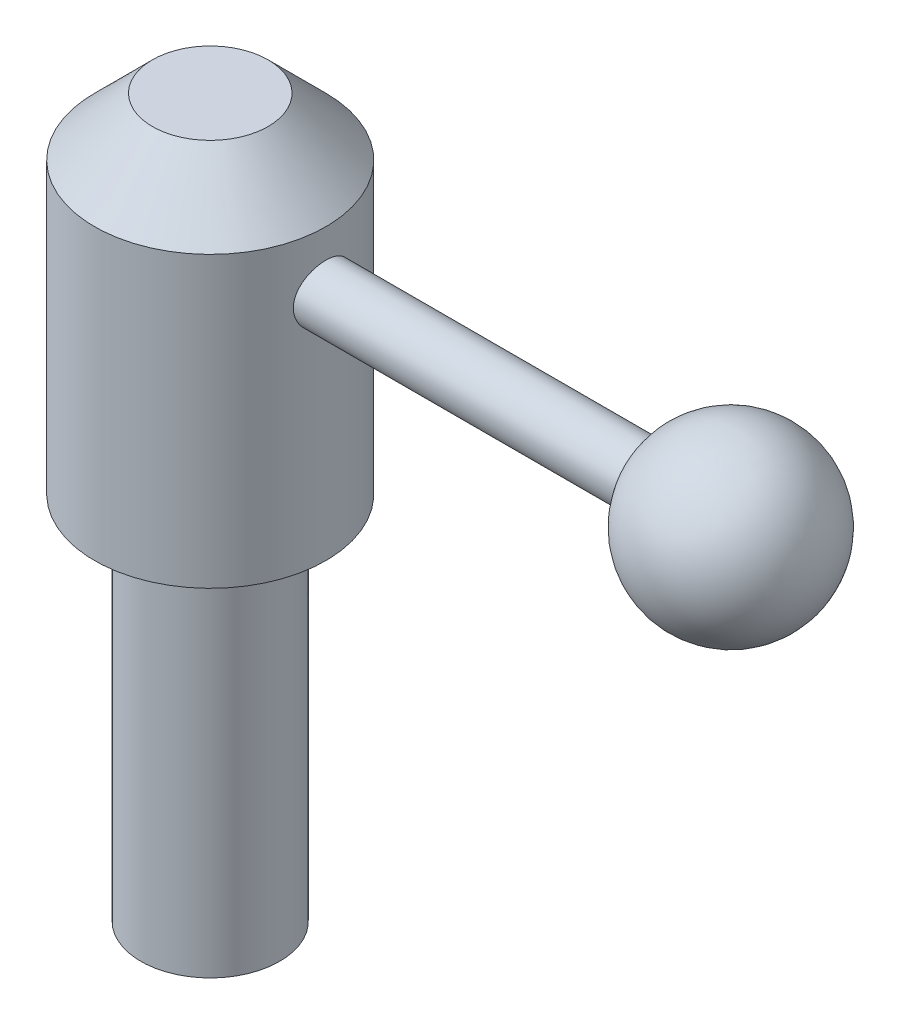
ISO-10303-21;
HEADER;
FILE_DESCRIPTION(('STEP AP214'),'2;1');
FILE_NAME('part.step','',(''),(''),'','','');
FILE_SCHEMA(('AUTOMOTIVE_DESIGN { 1 0 10303 214 1 1 1 1 }'));
ENDSEC;
DATA;
#1=APPLICATION_CONTEXT('core data for automotive mechanical design processes');
#2=APPLICATION_PROTOCOL_DEFINITION('international standard','automotive_design',2000,#1);
#3=PRODUCT_CONTEXT('',#1,'mechanical');
#4=PRODUCT('Part','Part','',(#3));
#5=PRODUCT_RELATED_PRODUCT_CATEGORY('part','',(#4));
#6=PRODUCT_DEFINITION_FORMATION('','',#4);
#7=PRODUCT_DEFINITION_CONTEXT('part definition',#1,'design');
#8=PRODUCT_DEFINITION('design','',#6,#7);
#9=PRODUCT_DEFINITION_SHAPE('','',#8);
#10=(LENGTH_UNIT() NAMED_UNIT(*) SI_UNIT(.MILLI.,.METRE.));
#11=(NAMED_UNIT(*) PLANE_ANGLE_UNIT() SI_UNIT($,.RADIAN.));
#12=(NAMED_UNIT(*) SI_UNIT($,.STERADIAN.) SOLID_ANGLE_UNIT());
#13=UNCERTAINTY_MEASURE_WITH_UNIT(LENGTH_MEASURE(1.E-05),#10,'distance_accuracy_value','');
#14=(GEOMETRIC_REPRESENTATION_CONTEXT(3) GLOBAL_UNCERTAINTY_ASSIGNED_CONTEXT((#13)) GLOBAL_UNIT_ASSIGNED_CONTEXT((#10,
#11,#12)) REPRESENTATION_CONTEXT('',''));
#15=CARTESIAN_POINT('',(0.,0.,0.));
#16=DIRECTION('',(0.,0.,1.));
#17=DIRECTION('',(1.,0.,0.));
#18=AXIS2_PLACEMENT_3D('',#15,#16,#17);
#19=CARTESIAN_POINT('',(0.,0.,0.));
#20=DIRECTION('',(0.,-1.,0.));
#21=DIRECTION('',(0.,0.,-1.));
#22=AXIS2_PLACEMENT_3D('',#19,#20,#21);
#23=CYLINDRICAL_SURFACE('',#22,10.);
#24=CARTESIAN_POINT('',(0.,57.,0.));
#25=DIRECTION('',(0.,-1.,0.));
#26=DIRECTION('',(0.,0.,-1.));
#27=AXIS2_PLACEMENT_3D('',#24,#25,#26);
#28=CIRCLE('',#27,10.);
#29=CARTESIAN_POINT('',(0.,57.,-10.));
#30=VERTEX_POINT('',#29);
#31=EDGE_CURVE('E57',#30,#30,#28,.T.);
#32=ORIENTED_EDGE('',*,*,#31,.T.);
#33=EDGE_LOOP('',(#32));
#34=FACE_BOUND('',#33,.T.);
#35=CARTESIAN_POINT('',(0.,32.,0.));
#36=DIRECTION('',(0.,-1.,0.));
#37=DIRECTION('',(0.,0.,-1.));
#38=AXIS2_PLACEMENT_3D('',#35,#36,#37);
#39=CIRCLE('',#38,10.);
#40=CARTESIAN_POINT('',(0.,32.,-10.));
#41=VERTEX_POINT('',#40);
#42=EDGE_CURVE('E66',#41,#41,#39,.T.);
#43=ORIENTED_EDGE('',*,*,#42,.F.);
#44=EDGE_LOOP('',(#43));
#45=FACE_BOUND('',#44,.T.);
#46=CARTESIAN_POINT('',(9.68245836551854,52.,2.5));
#47=CARTESIAN_POINT('',(9.68246100087859,51.8619492490734,2.49999607859307));
#48=CARTESIAN_POINT('',(9.68544306014597,51.7238551013215,2.48852624549765));
#49=CARTESIAN_POINT('',(9.69701861992564,51.4516324218265,2.44302312546379));
#50=CARTESIAN_POINT('',(9.7056153862163,51.3175062455318,2.40897670674211));
#51=CARTESIAN_POINT('',(9.7273872459615,51.0571964618128,2.31949119963204));
#52=CARTESIAN_POINT('',(9.74055642690458,50.9310028446143,2.26407972785449));
#53=CARTESIAN_POINT('',(9.76998192028759,50.6896891474601,2.13352114126139));
#54=CARTESIAN_POINT('',(9.78623836378489,50.5745695379198,2.05837318856069));
#55=CARTESIAN_POINT('',(9.82040716355625,50.3561383547378,1.88870842731188));
#56=CARTESIAN_POINT('',(9.83834597623034,50.25310639965,1.79383688770405));
#57=CARTESIAN_POINT('',(9.87362875515294,50.0642386056397,1.58818206410066));
#58=CARTESIAN_POINT('',(9.89097266566388,49.9784043743783,1.4773972941803));
#59=CARTESIAN_POINT('',(9.92340415520582,49.8252245323687,1.24114520107895));
#60=CARTESIAN_POINT('',(9.93845687400592,49.7581536118385,1.11549457619512));
#61=CARTESIAN_POINT('',(9.96430811925984,49.6461903558469,0.854263184292759));
#62=CARTESIAN_POINT('',(9.97510727334344,49.6012947480845,0.718683885791938));
#63=CARTESIAN_POINT('',(9.9910475884818,49.5358521654214,0.44435875875416));
#64=CARTESIAN_POINT('',(9.99629893844314,49.5148303556734,0.305732719548973));
#65=CARTESIAN_POINT('',(10.000935941073,49.4962416207244,0.0268288192627658));
#66=CARTESIAN_POINT('',(10.000322460967,49.4986712277904,-0.113448794538073));
#67=CARTESIAN_POINT('',(9.99338094953533,49.5265748502501,-0.388380617930973));
#68=CARTESIAN_POINT('',(9.9871800234087,49.5515363250539,-0.523090539002673));
#69=CARTESIAN_POINT('',(9.96990836524857,49.6229712700485,-0.786345618534221));
#70=CARTESIAN_POINT('',(9.95883737398452,49.6694458853774,-0.9148904484261));
#71=CARTESIAN_POINT('',(9.93287509700884,49.7830025706871,-1.16351675875452));
#72=CARTESIAN_POINT('',(9.9179501969501,49.8502670446617,-1.28351127441626));
#73=CARTESIAN_POINT('',(9.88589903809692,50.0033556791163,-1.51068905585123));
#74=CARTESIAN_POINT('',(9.8687723965265,50.0891830685606,-1.61787008771377));
#75=CARTESIAN_POINT('',(9.83363713769356,50.2797087419824,-1.81943508771239));
#76=CARTESIAN_POINT('',(9.81561719525297,50.3848548923478,-1.91339419768799));
#77=CARTESIAN_POINT('',(9.78115043517327,50.6095999735403,-2.08244093990756));
#78=CARTESIAN_POINT('',(9.76470369108288,50.7291995794911,-2.15752769011507));
#79=CARTESIAN_POINT('',(9.73520496829319,50.9802900341489,-2.28697032255647));
#80=CARTESIAN_POINT('',(9.72216983717007,51.1118357303128,-2.34122391742613));
#81=CARTESIAN_POINT('',(9.70118640148668,51.3825854680769,-2.42671405159096));
#82=CARTESIAN_POINT('',(9.69323700842732,51.5217878639846,-2.45795551638266));
#83=CARTESIAN_POINT('',(9.68355356007456,51.7999595015299,-2.49582963866592));
#84=CARTESIAN_POINT('',(9.68166088976933,51.938837793341,-2.50309047391912));
#85=CARTESIAN_POINT('',(9.68387343364692,52.2158219365853,-2.49451699051516));
#86=CARTESIAN_POINT('',(9.687978095703,52.3539278579494,-2.47868479784981));
#87=CARTESIAN_POINT('',(9.70157081984979,52.6231142649486,-2.42492546393825));
#88=CARTESIAN_POINT('',(9.71096970242531,52.7542727265692,-2.38736406828191));
#89=CARTESIAN_POINT('',(9.73400718262805,53.0084314578533,-2.29161808167046));
#90=CARTESIAN_POINT('',(9.74764628246407,53.1314307590558,-2.2334310477125));
#91=CARTESIAN_POINT('',(9.77796137095511,53.3684412778669,-2.0967706679366));
#92=CARTESIAN_POINT('',(9.79469168607245,53.482228840043,-2.01792175383564));
#93=CARTESIAN_POINT('',(9.82917083071113,53.6951883628015,-1.84265073233612));
#94=CARTESIAN_POINT('',(9.84691982728307,53.7943579166501,-1.74622573701359));
#95=CARTESIAN_POINT('',(9.88197403031773,53.9778110425709,-1.53565680246181));
#96=CARTESIAN_POINT('',(9.8992570206188,54.0616600625488,-1.42112988132898));
#97=CARTESIAN_POINT('',(9.93097216613689,54.2089358669513,-1.17925670673668));
#98=CARTESIAN_POINT('',(9.94540447003949,54.2723637166082,-1.05191112239397));
#99=CARTESIAN_POINT('',(9.96970115738325,54.3764460345279,-0.788895504327726));
#100=CARTESIAN_POINT('',(9.97959830022409,54.4172642843791,-0.653293452569705));
#101=CARTESIAN_POINT('',(9.99385293395789,54.4754603346084,-0.376874400797017));
#102=CARTESIAN_POINT('',(9.99821149393421,54.492842658739,-0.236058412603101));
#103=CARTESIAN_POINT('',(10.0008542352202,54.5034189739388,0.0427088161083089));
#104=CARTESIAN_POINT('',(9.99929947199971,54.4972542727385,0.180634567415056));
#105=CARTESIAN_POINT('',(9.99064741143608,54.4623804317641,0.453418741036879));
#106=CARTESIAN_POINT('',(9.98355027892922,54.4336719624671,0.588277254452324));
#107=CARTESIAN_POINT('',(9.96463582134723,54.3548694505729,0.850427589111937));
#108=CARTESIAN_POINT('',(9.95284411255981,54.3048913667141,0.977756236452158));
#109=CARTESIAN_POINT('',(9.92578222284145,54.1850735524511,1.22229263260406));
#110=CARTESIAN_POINT('',(9.91051160346894,54.1152313183238,1.33949910316409));
#111=CARTESIAN_POINT('',(9.87768124200717,53.9557119150097,1.56350482105826));
#112=CARTESIAN_POINT('',(9.86007542354161,53.8655996427404,1.66998747074584));
#113=CARTESIAN_POINT('',(9.82476622642974,53.6689428700566,1.86653755068376));
#114=CARTESIAN_POINT('',(9.80706282418255,53.5623942097221,1.95660081269148));
#115=CARTESIAN_POINT('',(9.77318689613756,53.3334964645263,2.11940506617958));
#116=CARTESIAN_POINT('',(9.75704909183222,53.2108896915869,2.19179154854095));
#117=CARTESIAN_POINT('',(9.7285988873707,52.954861275313,2.31481724146368));
#118=CARTESIAN_POINT('',(9.71628370583034,52.8214475847654,2.36547227438038));
#119=CARTESIAN_POINT('',(9.69879771876843,52.5735574704121,2.43605632142751));
#120=CARTESIAN_POINT('',(9.69271657508747,52.4602670890347,2.4599829264922));
#121=CARTESIAN_POINT('',(9.6845459645655,52.2313278275058,2.49195573142943));
#122=CARTESIAN_POINT('',(9.68245615722769,52.115679149389,2.50000328592938));
#123=CARTESIAN_POINT('',(9.68245836551854,52.,2.5));
#124=B_SPLINE_CURVE_WITH_KNOTS('',3,(#46,#47,#48,#49,#50,#51,#52,#53,#54,#55,#56,#57,#58,#59,
#60,#61,#62,#63,#64,#65,#66,#67,#68,#69,#70,#71,#72,#73,#74,#75,#76,#77,#78,#79,#80,#81,#82,#83,
#84,#85,#86,#87,#88,#89,#90,#91,#92,#93,#94,#95,#96,#97,#98,#99,#100,#101,#102,#103,#104,#105,
#106,#107,#108,#109,#110,#111,#112,#113,#114,#115,#116,#117,#118,#119,#120,#121,#122,#123),
.UNSPECIFIED.,.T.,.F.,(4,2,2,2,2,2,2,2,2,2,2,2,2,2,2,2,2,2,2,2,2,2,2,2,2,2,2,2,2,2,2,2,2,2,2,2,
2,2,4),(0.,0.413727441736142,0.82769574142867,1.24113072716601,1.65458326755479,
2.07623954192977,2.49793521479867,2.92551496397921,3.35303159847093,3.77188750995347,
4.19068148666021,4.60018262688948,5.00970556724787,5.42292874254445,5.83622385468915,
6.26070466571912,6.68520531199803,7.11176432008404,7.53823200129548,7.95343574764204,
8.36860127188748,8.77697405014152,9.18539521426364,9.60182845864104,10.0183301888999,
10.4452533097027,10.872154157245,11.2959207281187,11.7196054891398,12.131834461324,
12.5440511738193,12.9540487656466,13.3640980574302,13.7839709658702,14.2039503157046,
14.6317647729113,15.0592672137502,15.4059782718573,15.7526597510792),.UNSPECIFIED.);
#125=CARTESIAN_POINT('',(9.68245836551854,52.,2.5));
#126=VERTEX_POINT('',#125);
#127=EDGE_CURVE('E10',#126,#126,#124,.T.);
#128=ORIENTED_EDGE('',*,*,#127,.F.);
#129=EDGE_LOOP('',(#128));
#130=FACE_BOUND('',#129,.T.);
#131=ADVANCED_FACE('F39',(#34,#45,#130),#23,.T.);
#132=CARTESIAN_POINT('',(0.,0.,0.));
#133=DIRECTION('',(0.,1.,0.));
#134=DIRECTION('',(0.,0.,1.));
#135=AXIS2_PLACEMENT_3D('',#132,#133,#134);
#136=PLANE('',#135);
#137=CARTESIAN_POINT('',(0.,0.,0.));
#138=DIRECTION('',(0.,-1.,0.));
#139=DIRECTION('',(0.,0.,-1.));
#140=AXIS2_PLACEMENT_3D('',#137,#138,#139);
#141=CIRCLE('',#140,6.);
#142=CARTESIAN_POINT('',(0.,0.,-6.));
#143=VERTEX_POINT('',#142);
#144=EDGE_CURVE('E58',#143,#143,#141,.T.);
#145=ORIENTED_EDGE('',*,*,#144,.T.);
#146=EDGE_LOOP('',(#145));
#147=FACE_BOUND('',#146,.T.);
#148=ADVANCED_FACE('F82',(#147),#136,.F.);
#149=CARTESIAN_POINT('',(0.,0.,0.));
#150=DIRECTION('',(0.,-1.,0.));
#151=DIRECTION('',(0.,0.,-1.));
#152=AXIS2_PLACEMENT_3D('',#149,#150,#151);
#153=CYLINDRICAL_SURFACE('',#152,6.);
#154=ORIENTED_EDGE('',*,*,#144,.F.);
#155=EDGE_LOOP('',(#154));
#156=FACE_BOUND('',#155,.T.);
#157=CARTESIAN_POINT('',(0.,32.,0.));
#158=DIRECTION('',(0.,-1.,0.));
#159=DIRECTION('',(0.,0.,-1.));
#160=AXIS2_PLACEMENT_3D('',#157,#158,#159);
#161=CIRCLE('',#160,6.);
#162=CARTESIAN_POINT('',(0.,32.,-6.));
#163=VERTEX_POINT('',#162);
#164=EDGE_CURVE('E63',#163,#163,#161,.T.);
#165=ORIENTED_EDGE('',*,*,#164,.T.);
#166=EDGE_LOOP('',(#165));
#167=FACE_BOUND('',#166,.T.);
#168=ADVANCED_FACE('F93',(#156,#167),#153,.T.);
#169=CARTESIAN_POINT('',(-6.,32.,0.));
#170=DIRECTION('',(0.,1.,0.));
#171=DIRECTION('',(0.,0.,1.));
#172=AXIS2_PLACEMENT_3D('',#169,#170,#171);
#173=PLANE('',#172);
#174=ORIENTED_EDGE('',*,*,#164,.F.);
#175=EDGE_LOOP('',(#174));
#176=FACE_BOUND('',#175,.T.);
#177=ORIENTED_EDGE('',*,*,#42,.T.);
#178=EDGE_LOOP('',(#177));
#179=FACE_BOUND('',#178,.T.);
#180=ADVANCED_FACE('F100',(#176,#179),#173,.F.);
#181=CARTESIAN_POINT('',(-10.,62.,0.));
#182=DIRECTION('',(0.,-1.,0.));
#183=DIRECTION('',(0.,0.,-1.));
#184=AXIS2_PLACEMENT_3D('',#181,#182,#183);
#185=PLANE('',#184);
#186=CARTESIAN_POINT('',(0.,62.,0.));
#187=DIRECTION('',(0.,-1.,0.));
#188=DIRECTION('',(0.,0.,-1.));
#189=AXIS2_PLACEMENT_3D('',#186,#187,#188);
#190=CIRCLE('',#189,4.99999999999998);
#191=CARTESIAN_POINT('',(0.,62.,-4.99999999999998));
#192=VERTEX_POINT('',#191);
#193=EDGE_CURVE('E55',#192,#192,#190,.F.);
#194=ORIENTED_EDGE('',*,*,#193,.T.);
#195=EDGE_LOOP('',(#194));
#196=FACE_BOUND('',#195,.T.);
#197=ADVANCED_FACE('F96',(#196),#185,.F.);
#198=CARTESIAN_POINT('',(0.,57.,0.));
#199=DIRECTION('',(0.,-1.,0.));
#200=DIRECTION('',(0.,0.,-1.));
#201=AXIS2_PLACEMENT_3D('',#198,#199,#200);
#202=CONICAL_SURFACE('',#201,10.,0.78539816339745);
#203=ORIENTED_EDGE('',*,*,#193,.F.);
#204=EDGE_LOOP('',(#203));
#205=FACE_BOUND('',#204,.T.);
#206=ORIENTED_EDGE('',*,*,#31,.F.);
#207=EDGE_LOOP('',(#206));
#208=FACE_BOUND('',#207,.T.);
#209=ADVANCED_FACE('F45',(#205,#208),#202,.T.);
#210=CARTESIAN_POINT('',(0.,52.,0.));
#211=DIRECTION('',(-1.,0.,0.));
#212=DIRECTION('',(0.,0.,1.));
#213=AXIS2_PLACEMENT_3D('',#210,#211,#212);
#214=CYLINDRICAL_SURFACE('',#213,2.5);
#215=CARTESIAN_POINT('',(37.9289321881345,52.,0.));
#216=DIRECTION('',(-1.,0.,0.));
#217=DIRECTION('',(0.,0.,1.));
#218=AXIS2_PLACEMENT_3D('',#215,#216,#217);
#219=CIRCLE('',#218,2.5);
#220=CARTESIAN_POINT('',(37.9289321881345,52.,2.5));
#221=VERTEX_POINT('',#220);
#222=EDGE_CURVE('E72',#221,#221,#219,.T.);
#223=ORIENTED_EDGE('',*,*,#222,.T.);
#224=EDGE_LOOP('',(#223));
#225=FACE_BOUND('',#224,.T.);
#226=ORIENTED_EDGE('',*,*,#127,.T.);
#227=EDGE_LOOP('',(#226));
#228=FACE_BOUND('',#227,.T.);
#229=ADVANCED_FACE('F73',(#225,#228),#214,.T.);
#230=CARTESIAN_POINT('',(45.,52.,0.));
#231=DIRECTION('',(-1.,0.,0.));
#232=DIRECTION('',(0.,1.,0.));
#233=AXIS2_PLACEMENT_3D('',#230,#231,#232);
#234=SPHERICAL_SURFACE('',#233,7.5);
#235=ORIENTED_EDGE('',*,*,#222,.F.);
#236=EDGE_LOOP('',(#235));
#237=FACE_BOUND('',#236,.T.);
#238=ADVANCED_FACE('F80',(#237),#234,.T.);
#239=CLOSED_SHELL('',(#131,#148,#168,#180,#197,#209,#229,#238));
#240=MANIFOLD_SOLID_BREP('B2',#239);
#241=ADVANCED_BREP_SHAPE_REPRESENTATION('',(#18,#240),#14);
#242=SHAPE_DEFINITION_REPRESENTATION(#9,#241);
ENDSEC;
END-ISO-10303-21;
